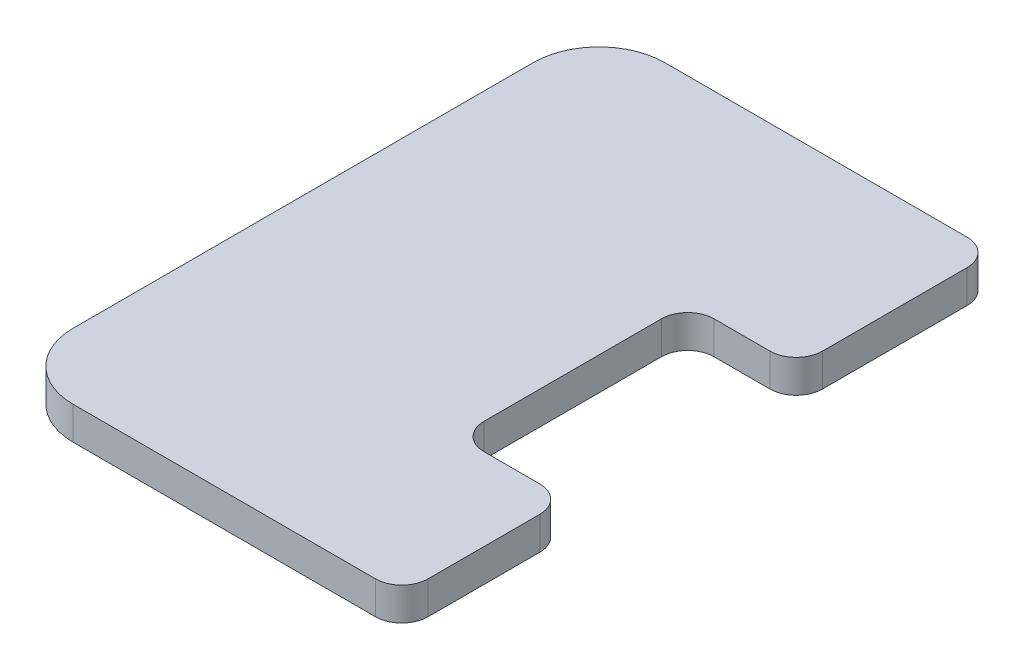
ISO-10303-21;
HEADER;
FILE_DESCRIPTION(('STEP AP214'),'2;1');
FILE_NAME('part.step','',(''),(''),'','','');
FILE_SCHEMA(('AUTOMOTIVE_DESIGN { 1 0 10303 214 1 1 1 1 }'));
ENDSEC;
DATA;
#1=APPLICATION_CONTEXT('core data for automotive mechanical design processes');
#2=APPLICATION_PROTOCOL_DEFINITION('international standard','automotive_design',2000,#1);
#3=PRODUCT_CONTEXT('',#1,'mechanical');
#4=PRODUCT('Part','Part','',(#3));
#5=PRODUCT_RELATED_PRODUCT_CATEGORY('part','',(#4));
#6=PRODUCT_DEFINITION_FORMATION('','',#4);
#7=PRODUCT_DEFINITION_CONTEXT('part definition',#1,'design');
#8=PRODUCT_DEFINITION('design','',#6,#7);
#9=PRODUCT_DEFINITION_SHAPE('','',#8);
#10=(LENGTH_UNIT() NAMED_UNIT(*) SI_UNIT(.MILLI.,.METRE.));
#11=(NAMED_UNIT(*) PLANE_ANGLE_UNIT() SI_UNIT($,.RADIAN.));
#12=(NAMED_UNIT(*) SI_UNIT($,.STERADIAN.) SOLID_ANGLE_UNIT());
#13=UNCERTAINTY_MEASURE_WITH_UNIT(LENGTH_MEASURE(1.E-05),#10,'distance_accuracy_value','');
#14=(GEOMETRIC_REPRESENTATION_CONTEXT(3) GLOBAL_UNCERTAINTY_ASSIGNED_CONTEXT((#13)) GLOBAL_UNIT_ASSIGNED_CONTEXT((#10,
#11,#12)) REPRESENTATION_CONTEXT('',''));
#15=CARTESIAN_POINT('',(0.,0.,0.));
#16=DIRECTION('',(0.,0.,1.));
#17=DIRECTION('',(1.,0.,0.));
#18=AXIS2_PLACEMENT_3D('',#15,#16,#17);
#19=CARTESIAN_POINT('',(19.05,3.175,-28.575));
#20=DIRECTION('',(-1.,0.,0.));
#21=DIRECTION('',(0.,0.,-1.));
#22=AXIS2_PLACEMENT_3D('',#19,#20,#21);
#23=PLANE('',#22);
#24=DIRECTION('',(0.,0.,1.));
#25=VECTOR('',#24,1.);
#26=CARTESIAN_POINT('',(19.05,3.175,-28.575));
#27=LINE('',#26,#25);
#28=CARTESIAN_POINT('',(19.05,3.175,-26.035));
#29=VERTEX_POINT('',#28);
#30=CARTESIAN_POINT('',(19.05,3.175,-12.065));
#31=VERTEX_POINT('',#30);
#32=EDGE_CURVE('E268',#29,#31,#27,.T.);
#33=ORIENTED_EDGE('',*,*,#32,.T.);
#34=DIRECTION('',(0.,1.,0.));
#35=VECTOR('',#34,1.);
#36=CARTESIAN_POINT('',(19.05,3.175,-12.065));
#37=LINE('',#36,#35);
#38=CARTESIAN_POINT('',(19.05,0.,-12.065));
#39=VERTEX_POINT('',#38);
#40=EDGE_CURVE('E175',#39,#31,#37,.T.);
#41=ORIENTED_EDGE('',*,*,#40,.F.);
#42=DIRECTION('',(0.,0.,1.));
#43=VECTOR('',#42,1.);
#44=CARTESIAN_POINT('',(19.05,0.,-28.575));
#45=LINE('',#44,#43);
#46=CARTESIAN_POINT('',(19.05,0.,-26.035));
#47=VERTEX_POINT('',#46);
#48=EDGE_CURVE('E157',#47,#39,#45,.T.);
#49=ORIENTED_EDGE('',*,*,#48,.F.);
#50=DIRECTION('',(0.,-1.,0.));
#51=VECTOR('',#50,1.);
#52=CARTESIAN_POINT('',(19.05,3.175,-26.035));
#53=LINE('',#52,#51);
#54=EDGE_CURVE('E168',#29,#47,#53,.T.);
#55=ORIENTED_EDGE('',*,*,#54,.F.);
#56=EDGE_LOOP('',(#33,#41,#49,#55));
#57=FACE_BOUND('',#56,.T.);
#58=ADVANCED_FACE('F41',(#57),#23,.F.);
#59=CARTESIAN_POINT('',(19.05,0.,15.24));
#60=VERTEX_POINT('',#59);
#61=CARTESIAN_POINT('',(19.05,0.,26.035));
#62=VERTEX_POINT('',#61);
#63=EDGE_CURVE('E179',#60,#62,#45,.T.);
#64=ORIENTED_EDGE('',*,*,#63,.F.);
#65=DIRECTION('',(0.,1.,0.));
#66=VECTOR('',#65,1.);
#67=CARTESIAN_POINT('',(19.05,3.175,15.24));
#68=LINE('',#67,#66);
#69=CARTESIAN_POINT('',(19.05,3.175,15.24));
#70=VERTEX_POINT('',#69);
#71=EDGE_CURVE('E212',#70,#60,#68,.F.);
#72=ORIENTED_EDGE('',*,*,#71,.F.);
#73=CARTESIAN_POINT('',(19.05,3.175,26.035));
#74=VERTEX_POINT('',#73);
#75=EDGE_CURVE('E193',#70,#74,#27,.T.);
#76=ORIENTED_EDGE('',*,*,#75,.T.);
#77=DIRECTION('',(0.,-1.,0.));
#78=VECTOR('',#77,1.);
#79=CARTESIAN_POINT('',(19.05,3.175,26.035));
#80=LINE('',#79,#78);
#81=EDGE_CURVE('E215',#62,#74,#80,.F.);
#82=ORIENTED_EDGE('',*,*,#81,.F.);
#83=EDGE_LOOP('',(#64,#72,#76,#82));
#84=FACE_BOUND('',#83,.T.);
#85=ADVANCED_FACE('F308',(#84),#23,.F.);
#86=CARTESIAN_POINT('',(-19.05,3.175,28.575));
#87=DIRECTION('',(0.,0.,-1.));
#88=DIRECTION('',(1.,0.,0.));
#89=AXIS2_PLACEMENT_3D('',#86,#87,#88);
#90=PLANE('',#89);
#91=DIRECTION('',(-1.,0.,0.));
#92=VECTOR('',#91,1.);
#93=CARTESIAN_POINT('',(-19.05,0.,28.575));
#94=LINE('',#93,#92);
#95=CARTESIAN_POINT('',(16.51,0.,28.575));
#96=VERTEX_POINT('',#95);
#97=CARTESIAN_POINT('',(-12.7,0.,28.575));
#98=VERTEX_POINT('',#97);
#99=EDGE_CURVE('E178',#96,#98,#94,.T.);
#100=ORIENTED_EDGE('',*,*,#99,.F.);
#101=DIRECTION('',(0.,-1.,0.));
#102=VECTOR('',#101,1.);
#103=CARTESIAN_POINT('',(16.51,3.175,28.575));
#104=LINE('',#103,#102);
#105=CARTESIAN_POINT('',(16.51,3.175,28.575));
#106=VERTEX_POINT('',#105);
#107=EDGE_CURVE('E209',#106,#96,#104,.T.);
#108=ORIENTED_EDGE('',*,*,#107,.F.);
#109=DIRECTION('',(-1.,0.,0.));
#110=VECTOR('',#109,1.);
#111=CARTESIAN_POINT('',(-19.05,3.175,28.575));
#112=LINE('',#111,#110);
#113=CARTESIAN_POINT('',(-12.7,3.175,28.575));
#114=VERTEX_POINT('',#113);
#115=EDGE_CURVE('E264',#106,#114,#112,.T.);
#116=ORIENTED_EDGE('',*,*,#115,.T.);
#117=DIRECTION('',(0.,-1.,0.));
#118=VECTOR('',#117,1.);
#119=CARTESIAN_POINT('',(-12.7,3.175,28.575));
#120=LINE('',#119,#118);
#121=EDGE_CURVE('E11',#98,#114,#120,.F.);
#122=ORIENTED_EDGE('',*,*,#121,.F.);
#123=EDGE_LOOP('',(#100,#108,#116,#122));
#124=FACE_BOUND('',#123,.T.);
#125=ADVANCED_FACE('F315',(#124),#90,.F.);
#126=CARTESIAN_POINT('',(-19.05,3.175,-28.575));
#127=DIRECTION('',(1.,0.,0.));
#128=DIRECTION('',(0.,0.,1.));
#129=AXIS2_PLACEMENT_3D('',#126,#127,#128);
#130=PLANE('',#129);
#131=DIRECTION('',(0.,0.,-1.));
#132=VECTOR('',#131,1.);
#133=CARTESIAN_POINT('',(-19.05,0.,-28.575));
#134=LINE('',#133,#132);
#135=CARTESIAN_POINT('',(-19.05,0.,22.225));
#136=VERTEX_POINT('',#135);
#137=CARTESIAN_POINT('',(-19.05,0.,-22.225));
#138=VERTEX_POINT('',#137);
#139=EDGE_CURVE('E182',#136,#138,#134,.T.);
#140=ORIENTED_EDGE('',*,*,#139,.F.);
#141=DIRECTION('',(0.,-1.,0.));
#142=VECTOR('',#141,1.);
#143=CARTESIAN_POINT('',(-19.05,3.175,22.225));
#144=LINE('',#143,#142);
#145=CARTESIAN_POINT('',(-19.05,3.175,22.225));
#146=VERTEX_POINT('',#145);
#147=EDGE_CURVE('E249',#146,#136,#144,.T.);
#148=ORIENTED_EDGE('',*,*,#147,.F.);
#149=DIRECTION('',(0.,0.,-1.));
#150=VECTOR('',#149,1.);
#151=CARTESIAN_POINT('',(-19.05,3.175,-28.575));
#152=LINE('',#151,#150);
#153=CARTESIAN_POINT('',(-19.05,3.175,-22.225));
#154=VERTEX_POINT('',#153);
#155=EDGE_CURVE('E263',#146,#154,#152,.T.);
#156=ORIENTED_EDGE('',*,*,#155,.T.);
#157=DIRECTION('',(0.,-1.,0.));
#158=VECTOR('',#157,1.);
#159=CARTESIAN_POINT('',(-19.05,3.175,-22.225));
#160=LINE('',#159,#158);
#161=EDGE_CURVE('E252',#138,#154,#160,.F.);
#162=ORIENTED_EDGE('',*,*,#161,.F.);
#163=EDGE_LOOP('',(#140,#148,#156,#162));
#164=FACE_BOUND('',#163,.T.);
#165=ADVANCED_FACE('F318',(#164),#130,.F.);
#166=CARTESIAN_POINT('',(-19.05,3.175,-28.575));
#167=DIRECTION('',(0.,0.,1.));
#168=DIRECTION('',(-1.,0.,0.));
#169=AXIS2_PLACEMENT_3D('',#166,#167,#168);
#170=PLANE('',#169);
#171=DIRECTION('',(1.,0.,0.));
#172=VECTOR('',#171,1.);
#173=CARTESIAN_POINT('',(-19.05,3.175,-28.575));
#174=LINE('',#173,#172);
#175=CARTESIAN_POINT('',(-12.7,3.175,-28.575));
#176=VERTEX_POINT('',#175);
#177=CARTESIAN_POINT('',(16.51,3.175,-28.575));
#178=VERTEX_POINT('',#177);
#179=EDGE_CURVE('E187',#176,#178,#174,.T.);
#180=ORIENTED_EDGE('',*,*,#179,.T.);
#181=DIRECTION('',(0.,-1.,0.));
#182=VECTOR('',#181,1.);
#183=CARTESIAN_POINT('',(16.51,3.175,-28.575));
#184=LINE('',#183,#182);
#185=CARTESIAN_POINT('',(16.51,0.,-28.575));
#186=VERTEX_POINT('',#185);
#187=EDGE_CURVE('E164',#186,#178,#184,.F.);
#188=ORIENTED_EDGE('',*,*,#187,.F.);
#189=DIRECTION('',(1.,0.,0.));
#190=VECTOR('',#189,1.);
#191=CARTESIAN_POINT('',(-19.05,0.,-28.575));
#192=LINE('',#191,#190);
#193=CARTESIAN_POINT('',(-12.7,0.,-28.575));
#194=VERTEX_POINT('',#193);
#195=EDGE_CURVE('E160',#194,#186,#192,.T.);
#196=ORIENTED_EDGE('',*,*,#195,.F.);
#197=DIRECTION('',(0.,-1.,0.));
#198=VECTOR('',#197,1.);
#199=CARTESIAN_POINT('',(-12.7,3.175,-28.575));
#200=LINE('',#199,#198);
#201=EDGE_CURVE('E242',#176,#194,#200,.T.);
#202=ORIENTED_EDGE('',*,*,#201,.F.);
#203=EDGE_LOOP('',(#180,#188,#196,#202));
#204=FACE_BOUND('',#203,.T.);
#205=ADVANCED_FACE('F261',(#204),#170,.F.);
#206=CARTESIAN_POINT('',(0.,3.175,0.));
#207=DIRECTION('',(0.,-1.,0.));
#208=DIRECTION('',(0.,0.,1.));
#209=AXIS2_PLACEMENT_3D('',#206,#207,#208);
#210=PLANE('',#209);
#211=ORIENTED_EDGE('',*,*,#155,.F.);
#212=CARTESIAN_POINT('',(-12.7,3.175,22.225));
#213=DIRECTION('',(0.,1.,0.));
#214=DIRECTION('',(0.,0.,1.));
#215=AXIS2_PLACEMENT_3D('',#212,#213,#214);
#216=CIRCLE('',#215,6.35);
#217=EDGE_CURVE('E56',#114,#146,#216,.F.);
#218=ORIENTED_EDGE('',*,*,#217,.F.);
#219=ORIENTED_EDGE('',*,*,#115,.F.);
#220=CARTESIAN_POINT('',(16.51,3.175,26.035));
#221=DIRECTION('',(0.,1.,0.));
#222=DIRECTION('',(0.,0.,1.));
#223=AXIS2_PLACEMENT_3D('',#220,#221,#222);
#224=CIRCLE('',#223,2.54);
#225=EDGE_CURVE('E206',#74,#106,#224,.F.);
#226=ORIENTED_EDGE('',*,*,#225,.F.);
#227=ORIENTED_EDGE('',*,*,#75,.F.);
#228=CARTESIAN_POINT('',(16.51,3.175,15.24));
#229=DIRECTION('',(0.,1.,0.));
#230=DIRECTION('',(0.,0.,1.));
#231=AXIS2_PLACEMENT_3D('',#228,#229,#230);
#232=CIRCLE('',#231,2.54);
#233=CARTESIAN_POINT('',(16.51,3.175,12.7));
#234=VERTEX_POINT('',#233);
#235=EDGE_CURVE('E201',#234,#70,#232,.F.);
#236=ORIENTED_EDGE('',*,*,#235,.F.);
#237=DIRECTION('',(-1.,0.,0.));
#238=VECTOR('',#237,1.);
#239=CARTESIAN_POINT('',(8.5725,3.175,12.7));
#240=LINE('',#239,#238);
#241=CARTESIAN_POINT('',(11.1125,3.175,12.7));
#242=VERTEX_POINT('',#241);
#243=EDGE_CURVE('E280',#234,#242,#240,.T.);
#244=ORIENTED_EDGE('',*,*,#243,.T.);
#245=CARTESIAN_POINT('',(11.1125,3.175,10.16));
#246=DIRECTION('',(0.,1.,0.));
#247=DIRECTION('',(0.,0.,1.));
#248=AXIS2_PLACEMENT_3D('',#245,#246,#247);
#249=CIRCLE('',#248,2.54);
#250=CARTESIAN_POINT('',(8.5725,3.175,10.16));
#251=VERTEX_POINT('',#250);
#252=EDGE_CURVE('E236',#251,#242,#249,.T.);
#253=ORIENTED_EDGE('',*,*,#252,.F.);
#254=DIRECTION('',(0.,0.,-1.));
#255=VECTOR('',#254,1.);
#256=CARTESIAN_POINT('',(8.5725,3.175,-9.525));
#257=LINE('',#256,#255);
#258=CARTESIAN_POINT('',(8.5725,3.175,-6.985));
#259=VERTEX_POINT('',#258);
#260=EDGE_CURVE('E277',#251,#259,#257,.T.);
#261=ORIENTED_EDGE('',*,*,#260,.T.);
#262=CARTESIAN_POINT('',(11.1125,3.175,-6.985));
#263=DIRECTION('',(0.,1.,0.));
#264=DIRECTION('',(0.,0.,1.));
#265=AXIS2_PLACEMENT_3D('',#262,#263,#264);
#266=CIRCLE('',#265,2.54);
#267=CARTESIAN_POINT('',(11.1125,3.175,-9.525));
#268=VERTEX_POINT('',#267);
#269=EDGE_CURVE('E230',#268,#259,#266,.T.);
#270=ORIENTED_EDGE('',*,*,#269,.F.);
#271=DIRECTION('',(1.,0.,0.));
#272=VECTOR('',#271,1.);
#273=CARTESIAN_POINT('',(19.05,3.175,-9.525));
#274=LINE('',#273,#272);
#275=CARTESIAN_POINT('',(16.51,3.175,-9.525));
#276=VERTEX_POINT('',#275);
#277=EDGE_CURVE('E273',#268,#276,#274,.T.);
#278=ORIENTED_EDGE('',*,*,#277,.T.);
#279=CARTESIAN_POINT('',(16.51,3.175,-12.065));
#280=DIRECTION('',(0.,1.,0.));
#281=DIRECTION('',(0.,0.,1.));
#282=AXIS2_PLACEMENT_3D('',#279,#280,#281);
#283=CIRCLE('',#282,2.54);
#284=EDGE_CURVE('E203',#31,#276,#283,.F.);
#285=ORIENTED_EDGE('',*,*,#284,.F.);
#286=ORIENTED_EDGE('',*,*,#32,.F.);
#287=CARTESIAN_POINT('',(16.51,3.175,-26.035));
#288=DIRECTION('',(0.,1.,0.));
#289=DIRECTION('',(0.,0.,1.));
#290=AXIS2_PLACEMENT_3D('',#287,#288,#289);
#291=CIRCLE('',#290,2.54);
#292=EDGE_CURVE('E170',#178,#29,#291,.F.);
#293=ORIENTED_EDGE('',*,*,#292,.F.);
#294=ORIENTED_EDGE('',*,*,#179,.F.);
#295=CARTESIAN_POINT('',(-12.7,3.175,-22.225));
#296=DIRECTION('',(0.,1.,0.));
#297=DIRECTION('',(0.,0.,1.));
#298=AXIS2_PLACEMENT_3D('',#295,#296,#297);
#299=CIRCLE('',#298,6.35);
#300=EDGE_CURVE('E49',#154,#176,#299,.F.);
#301=ORIENTED_EDGE('',*,*,#300,.F.);
#302=EDGE_LOOP('',(#211,#218,#219,#226,#227,#236,#244,#253,#261,#270,#278,#285,#286,#293,#294,#301));
#303=FACE_BOUND('',#302,.T.);
#304=ADVANCED_FACE('F262',(#303),#210,.F.);
#305=CARTESIAN_POINT('',(0.,0.,0.));
#306=DIRECTION('',(0.,-1.,0.));
#307=DIRECTION('',(0.,0.,1.));
#308=AXIS2_PLACEMENT_3D('',#305,#306,#307);
#309=PLANE('',#308);
#310=ORIENTED_EDGE('',*,*,#195,.T.);
#311=CARTESIAN_POINT('',(16.51,0.,-26.035));
#312=DIRECTION('',(0.,1.,0.));
#313=DIRECTION('',(0.,0.,1.));
#314=AXIS2_PLACEMENT_3D('',#311,#312,#313);
#315=CIRCLE('',#314,2.54);
#316=EDGE_CURVE('E152',#47,#186,#315,.T.);
#317=ORIENTED_EDGE('',*,*,#316,.F.);
#318=ORIENTED_EDGE('',*,*,#48,.T.);
#319=CARTESIAN_POINT('',(16.51,0.,-12.065));
#320=DIRECTION('',(0.,1.,0.));
#321=DIRECTION('',(0.,0.,1.));
#322=AXIS2_PLACEMENT_3D('',#319,#320,#321);
#323=CIRCLE('',#322,2.54);
#324=CARTESIAN_POINT('',(16.51,0.,-9.525));
#325=VERTEX_POINT('',#324);
#326=EDGE_CURVE('E197',#325,#39,#323,.T.);
#327=ORIENTED_EDGE('',*,*,#326,.F.);
#328=DIRECTION('',(1.,0.,0.));
#329=VECTOR('',#328,1.);
#330=CARTESIAN_POINT('',(19.05,0.,-9.525));
#331=LINE('',#330,#329);
#332=CARTESIAN_POINT('',(11.1125,0.,-9.525));
#333=VERTEX_POINT('',#332);
#334=EDGE_CURVE('E185',#333,#325,#331,.T.);
#335=ORIENTED_EDGE('',*,*,#334,.F.);
#336=CARTESIAN_POINT('',(11.1125,0.,-6.985));
#337=DIRECTION('',(0.,1.,0.));
#338=DIRECTION('',(0.,0.,1.));
#339=AXIS2_PLACEMENT_3D('',#336,#337,#338);
#340=CIRCLE('',#339,2.54);
#341=CARTESIAN_POINT('',(8.5725,0.,-6.985));
#342=VERTEX_POINT('',#341);
#343=EDGE_CURVE('E233',#342,#333,#340,.F.);
#344=ORIENTED_EDGE('',*,*,#343,.F.);
#345=DIRECTION('',(0.,0.,-1.));
#346=VECTOR('',#345,1.);
#347=CARTESIAN_POINT('',(8.5725,0.,-9.525));
#348=LINE('',#347,#346);
#349=CARTESIAN_POINT('',(8.5725,0.,10.16));
#350=VERTEX_POINT('',#349);
#351=EDGE_CURVE('E285',#350,#342,#348,.T.);
#352=ORIENTED_EDGE('',*,*,#351,.F.);
#353=CARTESIAN_POINT('',(11.1125,0.,10.16));
#354=DIRECTION('',(0.,1.,0.));
#355=DIRECTION('',(0.,0.,1.));
#356=AXIS2_PLACEMENT_3D('',#353,#354,#355);
#357=CIRCLE('',#356,2.54);
#358=CARTESIAN_POINT('',(11.1125,0.,12.7));
#359=VERTEX_POINT('',#358);
#360=EDGE_CURVE('E239',#359,#350,#357,.F.);
#361=ORIENTED_EDGE('',*,*,#360,.F.);
#362=DIRECTION('',(-1.,0.,0.));
#363=VECTOR('',#362,1.);
#364=CARTESIAN_POINT('',(8.5725,0.,12.7));
#365=LINE('',#364,#363);
#366=CARTESIAN_POINT('',(16.51,0.,12.7));
#367=VERTEX_POINT('',#366);
#368=EDGE_CURVE('E276',#367,#359,#365,.T.);
#369=ORIENTED_EDGE('',*,*,#368,.F.);
#370=CARTESIAN_POINT('',(16.51,0.,15.24));
#371=DIRECTION('',(0.,1.,0.));
#372=DIRECTION('',(0.,0.,1.));
#373=AXIS2_PLACEMENT_3D('',#370,#371,#372);
#374=CIRCLE('',#373,2.54);
#375=EDGE_CURVE('E174',#60,#367,#374,.T.);
#376=ORIENTED_EDGE('',*,*,#375,.F.);
#377=ORIENTED_EDGE('',*,*,#63,.T.);
#378=CARTESIAN_POINT('',(16.51,0.,26.035));
#379=DIRECTION('',(0.,1.,0.));
#380=DIRECTION('',(0.,0.,1.));
#381=AXIS2_PLACEMENT_3D('',#378,#379,#380);
#382=CIRCLE('',#381,2.54);
#383=EDGE_CURVE('E165',#96,#62,#382,.T.);
#384=ORIENTED_EDGE('',*,*,#383,.F.);
#385=ORIENTED_EDGE('',*,*,#99,.T.);
#386=CARTESIAN_POINT('',(-12.7,0.,22.225));
#387=DIRECTION('',(0.,1.,0.));
#388=DIRECTION('',(0.,0.,1.));
#389=AXIS2_PLACEMENT_3D('',#386,#387,#388);
#390=CIRCLE('',#389,6.35);
#391=EDGE_CURVE('E245',#136,#98,#390,.T.);
#392=ORIENTED_EDGE('',*,*,#391,.F.);
#393=ORIENTED_EDGE('',*,*,#139,.T.);
#394=CARTESIAN_POINT('',(-12.7,0.,-22.225));
#395=DIRECTION('',(0.,1.,0.));
#396=DIRECTION('',(0.,0.,1.));
#397=AXIS2_PLACEMENT_3D('',#394,#395,#396);
#398=CIRCLE('',#397,6.35);
#399=EDGE_CURVE('E247',#194,#138,#398,.T.);
#400=ORIENTED_EDGE('',*,*,#399,.F.);
#401=EDGE_LOOP('',(#310,#317,#318,#327,#335,#344,#352,#361,#369,#376,#377,#384,#385,#392,#393,#400));
#402=FACE_BOUND('',#401,.T.);
#403=ADVANCED_FACE('F154',(#402),#309,.T.);
#404=CARTESIAN_POINT('',(19.05,0.,-9.525));
#405=DIRECTION('',(0.,0.,-1.));
#406=DIRECTION('',(1.,0.,0.));
#407=AXIS2_PLACEMENT_3D('',#404,#405,#406);
#408=PLANE('',#407);
#409=ORIENTED_EDGE('',*,*,#277,.F.);
#410=DIRECTION('',(0.,1.,0.));
#411=VECTOR('',#410,1.);
#412=CARTESIAN_POINT('',(11.1125,3.175,-9.525));
#413=LINE('',#412,#411);
#414=EDGE_CURVE('E218',#333,#268,#413,.T.);
#415=ORIENTED_EDGE('',*,*,#414,.F.);
#416=ORIENTED_EDGE('',*,*,#334,.T.);
#417=DIRECTION('',(0.,1.,0.));
#418=VECTOR('',#417,1.);
#419=CARTESIAN_POINT('',(16.51,0.,-9.525));
#420=LINE('',#419,#418);
#421=EDGE_CURVE('E220',#276,#325,#420,.F.);
#422=ORIENTED_EDGE('',*,*,#421,.F.);
#423=EDGE_LOOP('',(#409,#415,#416,#422));
#424=FACE_BOUND('',#423,.T.);
#425=ADVANCED_FACE('F417',(#424),#408,.F.);
#426=CARTESIAN_POINT('',(8.5725,0.,-9.525));
#427=DIRECTION('',(-1.,0.,0.));
#428=DIRECTION('',(0.,0.,-1.));
#429=AXIS2_PLACEMENT_3D('',#426,#427,#428);
#430=PLANE('',#429);
#431=ORIENTED_EDGE('',*,*,#260,.F.);
#432=DIRECTION('',(0.,1.,0.));
#433=VECTOR('',#432,1.);
#434=CARTESIAN_POINT('',(8.5725,3.175,10.16));
#435=LINE('',#434,#433);
#436=EDGE_CURVE('E222',#350,#251,#435,.T.);
#437=ORIENTED_EDGE('',*,*,#436,.F.);
#438=ORIENTED_EDGE('',*,*,#351,.T.);
#439=DIRECTION('',(0.,1.,0.));
#440=VECTOR('',#439,1.);
#441=CARTESIAN_POINT('',(8.5725,0.,-6.985));
#442=LINE('',#441,#440);
#443=EDGE_CURVE('E224',#259,#342,#442,.F.);
#444=ORIENTED_EDGE('',*,*,#443,.F.);
#445=EDGE_LOOP('',(#431,#437,#438,#444));
#446=FACE_BOUND('',#445,.T.);
#447=ADVANCED_FACE('F408',(#446),#430,.F.);
#448=CARTESIAN_POINT('',(8.5725,0.,12.7));
#449=DIRECTION('',(0.,0.,1.));
#450=DIRECTION('',(-1.,0.,0.));
#451=AXIS2_PLACEMENT_3D('',#448,#449,#450);
#452=PLANE('',#451);
#453=ORIENTED_EDGE('',*,*,#368,.T.);
#454=DIRECTION('',(0.,1.,0.));
#455=VECTOR('',#454,1.);
#456=CARTESIAN_POINT('',(11.1125,0.,12.7));
#457=LINE('',#456,#455);
#458=EDGE_CURVE('E226',#242,#359,#457,.F.);
#459=ORIENTED_EDGE('',*,*,#458,.F.);
#460=ORIENTED_EDGE('',*,*,#243,.F.);
#461=DIRECTION('',(0.,1.,0.));
#462=VECTOR('',#461,1.);
#463=CARTESIAN_POINT('',(16.51,0.,12.7));
#464=LINE('',#463,#462);
#465=EDGE_CURVE('E228',#367,#234,#464,.T.);
#466=ORIENTED_EDGE('',*,*,#465,.F.);
#467=EDGE_LOOP('',(#453,#459,#460,#466));
#468=FACE_BOUND('',#467,.T.);
#469=ADVANCED_FACE('F292',(#468),#452,.F.);
#470=CARTESIAN_POINT('',(16.51,3.175,-26.035));
#471=DIRECTION('',(0.,-1.,0.));
#472=DIRECTION('',(0.,0.,1.));
#473=AXIS2_PLACEMENT_3D('',#470,#471,#472);
#474=CYLINDRICAL_SURFACE('',#473,2.54);
#475=ORIENTED_EDGE('',*,*,#292,.T.);
#476=ORIENTED_EDGE('',*,*,#54,.T.);
#477=ORIENTED_EDGE('',*,*,#316,.T.);
#478=ORIENTED_EDGE('',*,*,#187,.T.);
#479=EDGE_LOOP('',(#475,#476,#477,#478));
#480=FACE_BOUND('',#479,.T.);
#481=ADVANCED_FACE('F169',(#480),#474,.T.);
#482=CARTESIAN_POINT('',(16.51,3.175,26.035));
#483=DIRECTION('',(0.,-1.,0.));
#484=DIRECTION('',(0.,0.,1.));
#485=AXIS2_PLACEMENT_3D('',#482,#483,#484);
#486=CYLINDRICAL_SURFACE('',#485,2.54);
#487=ORIENTED_EDGE('',*,*,#225,.T.);
#488=ORIENTED_EDGE('',*,*,#107,.T.);
#489=ORIENTED_EDGE('',*,*,#383,.T.);
#490=ORIENTED_EDGE('',*,*,#81,.T.);
#491=EDGE_LOOP('',(#487,#488,#489,#490));
#492=FACE_BOUND('',#491,.T.);
#493=ADVANCED_FACE('F310',(#492),#486,.T.);
#494=CARTESIAN_POINT('',(16.51,3.175,-12.065));
#495=DIRECTION('',(0.,1.,0.));
#496=DIRECTION('',(0.,0.,-1.));
#497=AXIS2_PLACEMENT_3D('',#494,#495,#496);
#498=CYLINDRICAL_SURFACE('',#497,2.54);
#499=ORIENTED_EDGE('',*,*,#326,.T.);
#500=ORIENTED_EDGE('',*,*,#40,.T.);
#501=ORIENTED_EDGE('',*,*,#284,.T.);
#502=ORIENTED_EDGE('',*,*,#421,.T.);
#503=EDGE_LOOP('',(#499,#500,#501,#502));
#504=FACE_BOUND('',#503,.T.);
#505=ADVANCED_FACE('F337',(#504),#498,.T.);
#506=CARTESIAN_POINT('',(11.1125,0.,-6.985));
#507=DIRECTION('',(0.,-1.,0.));
#508=DIRECTION('',(0.,0.,1.));
#509=AXIS2_PLACEMENT_3D('',#506,#507,#508);
#510=CYLINDRICAL_SURFACE('',#509,2.54);
#511=ORIENTED_EDGE('',*,*,#343,.T.);
#512=ORIENTED_EDGE('',*,*,#414,.T.);
#513=ORIENTED_EDGE('',*,*,#269,.T.);
#514=ORIENTED_EDGE('',*,*,#443,.T.);
#515=EDGE_LOOP('',(#511,#512,#513,#514));
#516=FACE_BOUND('',#515,.T.);
#517=ADVANCED_FACE('F340',(#516),#510,.F.);
#518=CARTESIAN_POINT('',(16.51,0.,15.24));
#519=DIRECTION('',(0.,1.,0.));
#520=DIRECTION('',(0.,0.,-1.));
#521=AXIS2_PLACEMENT_3D('',#518,#519,#520);
#522=CYLINDRICAL_SURFACE('',#521,2.54);
#523=ORIENTED_EDGE('',*,*,#375,.T.);
#524=ORIENTED_EDGE('',*,*,#465,.T.);
#525=ORIENTED_EDGE('',*,*,#235,.T.);
#526=ORIENTED_EDGE('',*,*,#71,.T.);
#527=EDGE_LOOP('',(#523,#524,#525,#526));
#528=FACE_BOUND('',#527,.T.);
#529=ADVANCED_FACE('F304',(#528),#522,.T.);
#530=CARTESIAN_POINT('',(11.1125,0.,10.16));
#531=DIRECTION('',(0.,-1.,0.));
#532=DIRECTION('',(0.,0.,1.));
#533=AXIS2_PLACEMENT_3D('',#530,#531,#532);
#534=CYLINDRICAL_SURFACE('',#533,2.54);
#535=ORIENTED_EDGE('',*,*,#360,.T.);
#536=ORIENTED_EDGE('',*,*,#436,.T.);
#537=ORIENTED_EDGE('',*,*,#252,.T.);
#538=ORIENTED_EDGE('',*,*,#458,.T.);
#539=EDGE_LOOP('',(#535,#536,#537,#538));
#540=FACE_BOUND('',#539,.T.);
#541=ADVANCED_FACE('F297',(#540),#534,.F.);
#542=CARTESIAN_POINT('',(-12.7,3.175,-22.225));
#543=DIRECTION('',(0.,-1.,0.));
#544=DIRECTION('',(0.,0.,1.));
#545=AXIS2_PLACEMENT_3D('',#542,#543,#544);
#546=CYLINDRICAL_SURFACE('',#545,6.35);
#547=ORIENTED_EDGE('',*,*,#300,.T.);
#548=ORIENTED_EDGE('',*,*,#201,.T.);
#549=ORIENTED_EDGE('',*,*,#399,.T.);
#550=ORIENTED_EDGE('',*,*,#161,.T.);
#551=EDGE_LOOP('',(#547,#548,#549,#550));
#552=FACE_BOUND('',#551,.T.);
#553=ADVANCED_FACE('F256',(#552),#546,.T.);
#554=CARTESIAN_POINT('',(-12.7,3.175,22.225));
#555=DIRECTION('',(0.,-1.,0.));
#556=DIRECTION('',(0.,0.,1.));
#557=AXIS2_PLACEMENT_3D('',#554,#555,#556);
#558=CYLINDRICAL_SURFACE('',#557,6.35);
#559=ORIENTED_EDGE('',*,*,#217,.T.);
#560=ORIENTED_EDGE('',*,*,#147,.T.);
#561=ORIENTED_EDGE('',*,*,#391,.T.);
#562=ORIENTED_EDGE('',*,*,#121,.T.);
#563=EDGE_LOOP('',(#559,#560,#561,#562));
#564=FACE_BOUND('',#563,.T.);
#565=ADVANCED_FACE('F43',(#564),#558,.T.);
#566=CLOSED_SHELL('',(#58,#85,#125,#165,#205,#304,#403,#425,#447,#469,#481,#493,#505,#517,#529,
#541,#553,#565));
#567=MANIFOLD_SOLID_BREP('B2',#566);
#568=ADVANCED_BREP_SHAPE_REPRESENTATION('',(#18,#567),#14);
#569=SHAPE_DEFINITION_REPRESENTATION(#9,#568);
ENDSEC;
END-ISO-10303-21;
